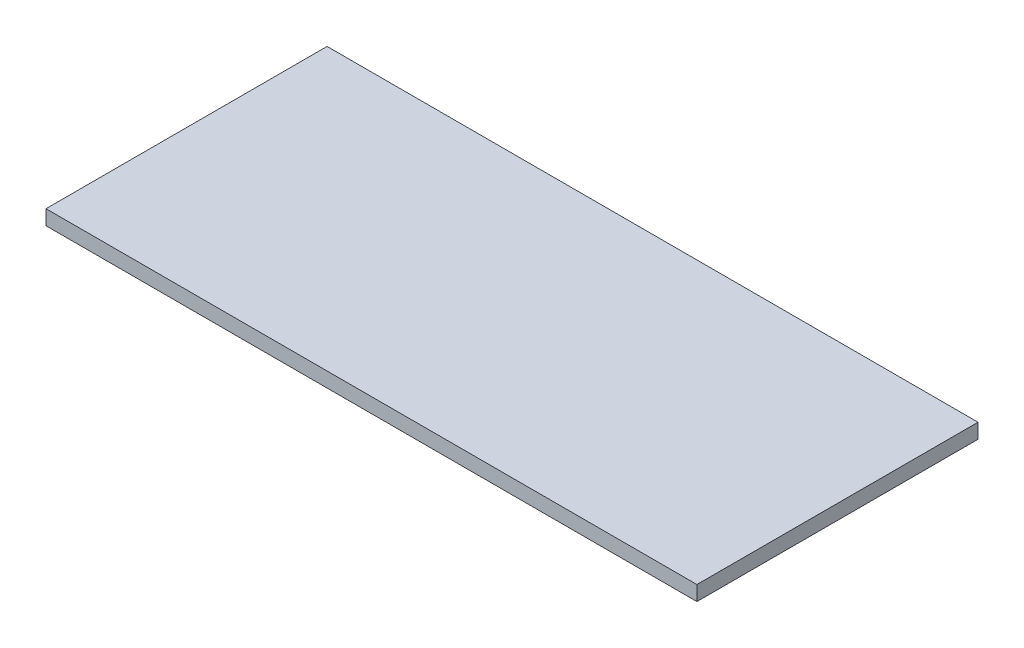
ISO-10303-21;
HEADER;
FILE_DESCRIPTION(('STEP AP214'),'2;1');
FILE_NAME('part.step','',(''),(''),'','','');
FILE_SCHEMA(('AUTOMOTIVE_DESIGN { 1 0 10303 214 1 1 1 1 }'));
ENDSEC;
DATA;
#1=APPLICATION_CONTEXT('core data for automotive mechanical design processes');
#2=APPLICATION_PROTOCOL_DEFINITION('international standard','automotive_design',2000,#1);
#3=PRODUCT_CONTEXT('',#1,'mechanical');
#4=PRODUCT('Part','Part','',(#3));
#5=PRODUCT_RELATED_PRODUCT_CATEGORY('part','',(#4));
#6=PRODUCT_DEFINITION_FORMATION('','',#4);
#7=PRODUCT_DEFINITION_CONTEXT('part definition',#1,'design');
#8=PRODUCT_DEFINITION('design','',#6,#7);
#9=PRODUCT_DEFINITION_SHAPE('','',#8);
#10=(LENGTH_UNIT() NAMED_UNIT(*) SI_UNIT(.MILLI.,.METRE.));
#11=(NAMED_UNIT(*) PLANE_ANGLE_UNIT() SI_UNIT($,.RADIAN.));
#12=(NAMED_UNIT(*) SI_UNIT($,.STERADIAN.) SOLID_ANGLE_UNIT());
#13=UNCERTAINTY_MEASURE_WITH_UNIT(LENGTH_MEASURE(1.E-05),#10,'distance_accuracy_value','');
#14=(GEOMETRIC_REPRESENTATION_CONTEXT(3) GLOBAL_UNCERTAINTY_ASSIGNED_CONTEXT((#13)) GLOBAL_UNIT_ASSIGNED_CONTEXT((#10,
#11,#12)) REPRESENTATION_CONTEXT('',''));
#15=CARTESIAN_POINT('',(0.,0.,0.));
#16=DIRECTION('',(0.,0.,1.));
#17=DIRECTION('',(1.,0.,0.));
#18=AXIS2_PLACEMENT_3D('',#15,#16,#17);
#19=CARTESIAN_POINT('',(-34.925,1.5875,-15.08125));
#20=DIRECTION('',(1.,0.,0.));
#21=DIRECTION('',(0.,0.,-1.));
#22=AXIS2_PLACEMENT_3D('',#19,#20,#21);
#23=PLANE('',#22);
#24=DIRECTION('',(0.,0.,1.));
#25=VECTOR('',#24,1.);
#26=CARTESIAN_POINT('',(-34.925,0.,-15.08125));
#27=LINE('',#26,#25);
#28=CARTESIAN_POINT('',(-34.925,0.,-15.08125));
#29=VERTEX_POINT('',#28);
#30=CARTESIAN_POINT('',(-34.925,0.,15.08125));
#31=VERTEX_POINT('',#30);
#32=EDGE_CURVE('E98',#29,#31,#27,.T.);
#33=ORIENTED_EDGE('',*,*,#32,.T.);
#34=DIRECTION('',(0.,-1.,0.));
#35=VECTOR('',#34,1.);
#36=CARTESIAN_POINT('',(-34.925,1.5875,15.08125));
#37=LINE('',#36,#35);
#38=CARTESIAN_POINT('',(-34.925,1.5875,15.08125));
#39=VERTEX_POINT('',#38);
#40=EDGE_CURVE('E11',#39,#31,#37,.T.);
#41=ORIENTED_EDGE('',*,*,#40,.F.);
#42=DIRECTION('',(0.,0.,1.));
#43=VECTOR('',#42,1.);
#44=CARTESIAN_POINT('',(-34.925,1.5875,-15.08125));
#45=LINE('',#44,#43);
#46=CARTESIAN_POINT('',(-34.925,1.5875,-15.08125));
#47=VERTEX_POINT('',#46);
#48=EDGE_CURVE('E86',#47,#39,#45,.T.);
#49=ORIENTED_EDGE('',*,*,#48,.F.);
#50=DIRECTION('',(0.,-1.,0.));
#51=VECTOR('',#50,1.);
#52=CARTESIAN_POINT('',(-34.925,1.5875,-15.08125));
#53=LINE('',#52,#51);
#54=EDGE_CURVE('E94',#47,#29,#53,.T.);
#55=ORIENTED_EDGE('',*,*,#54,.T.);
#56=EDGE_LOOP('',(#33,#41,#49,#55));
#57=FACE_BOUND('',#56,.T.);
#58=ADVANCED_FACE('F35',(#57),#23,.F.);
#59=CARTESIAN_POINT('',(34.925,1.5875,15.08125));
#60=DIRECTION('',(0.,0.,-1.));
#61=DIRECTION('',(-1.,0.,0.));
#62=AXIS2_PLACEMENT_3D('',#59,#60,#61);
#63=PLANE('',#62);
#64=DIRECTION('',(1.,0.,0.));
#65=VECTOR('',#64,1.);
#66=CARTESIAN_POINT('',(34.925,0.,15.08125));
#67=LINE('',#66,#65);
#68=CARTESIAN_POINT('',(34.925,0.,15.08125));
#69=VERTEX_POINT('',#68);
#70=EDGE_CURVE('E90',#31,#69,#67,.T.);
#71=ORIENTED_EDGE('',*,*,#70,.T.);
#72=DIRECTION('',(0.,-1.,0.));
#73=VECTOR('',#72,1.);
#74=CARTESIAN_POINT('',(34.925,1.5875,15.08125));
#75=LINE('',#74,#73);
#76=CARTESIAN_POINT('',(34.925,1.5875,15.08125));
#77=VERTEX_POINT('',#76);
#78=EDGE_CURVE('E43',#77,#69,#75,.T.);
#79=ORIENTED_EDGE('',*,*,#78,.F.);
#80=DIRECTION('',(1.,0.,0.));
#81=VECTOR('',#80,1.);
#82=CARTESIAN_POINT('',(34.925,1.5875,15.08125));
#83=LINE('',#82,#81);
#84=EDGE_CURVE('E81',#39,#77,#83,.T.);
#85=ORIENTED_EDGE('',*,*,#84,.F.);
#86=ORIENTED_EDGE('',*,*,#40,.T.);
#87=EDGE_LOOP('',(#71,#79,#85,#86));
#88=FACE_BOUND('',#87,.T.);
#89=ADVANCED_FACE('F89',(#88),#63,.F.);
#90=CARTESIAN_POINT('',(34.925,1.5875,-15.08125));
#91=DIRECTION('',(-1.,0.,0.));
#92=DIRECTION('',(0.,0.,1.));
#93=AXIS2_PLACEMENT_3D('',#90,#91,#92);
#94=PLANE('',#93);
#95=DIRECTION('',(0.,0.,-1.));
#96=VECTOR('',#95,1.);
#97=CARTESIAN_POINT('',(34.925,0.,-15.08125));
#98=LINE('',#97,#96);
#99=CARTESIAN_POINT('',(34.925,0.,-15.08125));
#100=VERTEX_POINT('',#99);
#101=EDGE_CURVE('E68',#69,#100,#98,.T.);
#102=ORIENTED_EDGE('',*,*,#101,.T.);
#103=DIRECTION('',(0.,-1.,0.));
#104=VECTOR('',#103,1.);
#105=CARTESIAN_POINT('',(34.925,1.5875,-15.08125));
#106=LINE('',#105,#104);
#107=CARTESIAN_POINT('',(34.925,1.5875,-15.08125));
#108=VERTEX_POINT('',#107);
#109=EDGE_CURVE('E91',#108,#100,#106,.T.);
#110=ORIENTED_EDGE('',*,*,#109,.F.);
#111=DIRECTION('',(0.,0.,-1.));
#112=VECTOR('',#111,1.);
#113=CARTESIAN_POINT('',(34.925,1.5875,-15.08125));
#114=LINE('',#113,#112);
#115=EDGE_CURVE('E84',#77,#108,#114,.T.);
#116=ORIENTED_EDGE('',*,*,#115,.F.);
#117=ORIENTED_EDGE('',*,*,#78,.T.);
#118=EDGE_LOOP('',(#102,#110,#116,#117));
#119=FACE_BOUND('',#118,.T.);
#120=ADVANCED_FACE('F92',(#119),#94,.F.);
#121=CARTESIAN_POINT('',(34.925,1.5875,-15.08125));
#122=DIRECTION('',(0.,0.,1.));
#123=DIRECTION('',(1.,0.,0.));
#124=AXIS2_PLACEMENT_3D('',#121,#122,#123);
#125=PLANE('',#124);
#126=DIRECTION('',(-1.,0.,0.));
#127=VECTOR('',#126,1.);
#128=CARTESIAN_POINT('',(34.925,0.,-15.08125));
#129=LINE('',#128,#127);
#130=EDGE_CURVE('E74',#100,#29,#129,.T.);
#131=ORIENTED_EDGE('',*,*,#130,.T.);
#132=ORIENTED_EDGE('',*,*,#54,.F.);
#133=DIRECTION('',(-1.,0.,0.));
#134=VECTOR('',#133,1.);
#135=CARTESIAN_POINT('',(34.925,1.5875,-15.08125));
#136=LINE('',#135,#134);
#137=EDGE_CURVE('E51',#108,#47,#136,.T.);
#138=ORIENTED_EDGE('',*,*,#137,.F.);
#139=ORIENTED_EDGE('',*,*,#109,.T.);
#140=EDGE_LOOP('',(#131,#132,#138,#139));
#141=FACE_BOUND('',#140,.T.);
#142=ADVANCED_FACE('F105',(#141),#125,.F.);
#143=CARTESIAN_POINT('',(0.,1.5875,0.));
#144=DIRECTION('',(0.,-1.,0.));
#145=DIRECTION('',(0.,0.,-1.));
#146=AXIS2_PLACEMENT_3D('',#143,#144,#145);
#147=PLANE('',#146);
#148=ORIENTED_EDGE('',*,*,#48,.T.);
#149=ORIENTED_EDGE('',*,*,#84,.T.);
#150=ORIENTED_EDGE('',*,*,#115,.T.);
#151=ORIENTED_EDGE('',*,*,#137,.T.);
#152=EDGE_LOOP('',(#148,#149,#150,#151));
#153=FACE_BOUND('',#152,.T.);
#154=ADVANCED_FACE('F82',(#153),#147,.F.);
#155=CARTESIAN_POINT('',(0.,0.,0.));
#156=DIRECTION('',(0.,-1.,0.));
#157=DIRECTION('',(0.,0.,-1.));
#158=AXIS2_PLACEMENT_3D('',#155,#156,#157);
#159=PLANE('',#158);
#160=ORIENTED_EDGE('',*,*,#32,.F.);
#161=ORIENTED_EDGE('',*,*,#130,.F.);
#162=ORIENTED_EDGE('',*,*,#101,.F.);
#163=ORIENTED_EDGE('',*,*,#70,.F.);
#164=EDGE_LOOP('',(#160,#161,#162,#163));
#165=FACE_BOUND('',#164,.T.);
#166=ADVANCED_FACE('F108',(#165),#159,.T.);
#167=CLOSED_SHELL('',(#58,#89,#120,#142,#154,#166));
#168=MANIFOLD_SOLID_BREP('B2',#167);
#169=ADVANCED_BREP_SHAPE_REPRESENTATION('',(#18,#168),#14);
#170=SHAPE_DEFINITION_REPRESENTATION(#9,#169);
ENDSEC;
END-ISO-10303-21;
